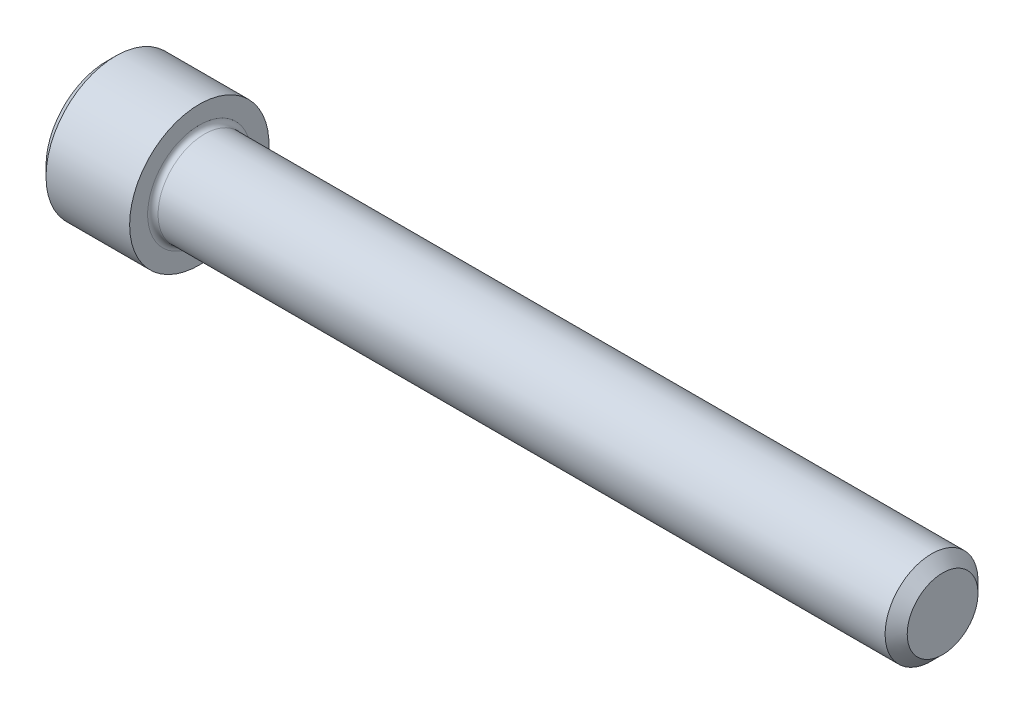
ISO-10303-21;
HEADER;
FILE_DESCRIPTION(('STEP AP214'),'2;1');
FILE_NAME('part.step','',(''),(''),'','','');
FILE_SCHEMA(('AUTOMOTIVE_DESIGN { 1 0 10303 214 1 1 1 1 }'));
ENDSEC;
DATA;
#1=APPLICATION_CONTEXT('core data for automotive mechanical design processes');
#2=APPLICATION_PROTOCOL_DEFINITION('international standard','automotive_design',2000,#1);
#3=PRODUCT_CONTEXT('',#1,'mechanical');
#4=PRODUCT('Part','Part','',(#3));
#5=PRODUCT_RELATED_PRODUCT_CATEGORY('part','',(#4));
#6=PRODUCT_DEFINITION_FORMATION('','',#4);
#7=PRODUCT_DEFINITION_CONTEXT('part definition',#1,'design');
#8=PRODUCT_DEFINITION('design','',#6,#7);
#9=PRODUCT_DEFINITION_SHAPE('','',#8);
#10=(LENGTH_UNIT() NAMED_UNIT(*) SI_UNIT(.MILLI.,.METRE.));
#11=(NAMED_UNIT(*) PLANE_ANGLE_UNIT() SI_UNIT($,.RADIAN.));
#12=(NAMED_UNIT(*) SI_UNIT($,.STERADIAN.) SOLID_ANGLE_UNIT());
#13=UNCERTAINTY_MEASURE_WITH_UNIT(LENGTH_MEASURE(1.E-05),#10,'distance_accuracy_value','');
#14=(GEOMETRIC_REPRESENTATION_CONTEXT(3) GLOBAL_UNCERTAINTY_ASSIGNED_CONTEXT((#13)) GLOBAL_UNIT_ASSIGNED_CONTEXT((#10,
#11,#12)) REPRESENTATION_CONTEXT('',''));
#15=CARTESIAN_POINT('',(0.,0.,0.));
#16=DIRECTION('',(0.,0.,1.));
#17=DIRECTION('',(1.,0.,0.));
#18=AXIS2_PLACEMENT_3D('',#15,#16,#17);
#19=CARTESIAN_POINT('',(0.,0.,0.));
#20=DIRECTION('',(-1.,0.,0.));
#21=DIRECTION('',(0.,0.,1.));
#22=AXIS2_PLACEMENT_3D('',#19,#20,#21);
#23=PLANE('',#22);
#24=DIRECTION('',(0.,-0.499999999999999,0.866025403784439));
#25=VECTOR('',#24,1.);
#26=CARTESIAN_POINT('',(0.,2.7496306570156,0.));
#27=LINE('',#26,#25);
#28=CARTESIAN_POINT('',(0.,2.7496306570156,0.));
#29=VERTEX_POINT('',#28);
#30=CARTESIAN_POINT('',(0.,1.3748153285078,2.38125));
#31=VERTEX_POINT('',#30);
#32=EDGE_CURVE('E259',#29,#31,#27,.T.);
#33=ORIENTED_EDGE('',*,*,#32,.T.);
#34=DIRECTION('',(0.,1.,0.));
#35=VECTOR('',#34,1.);
#36=CARTESIAN_POINT('',(0.,-1.37481532850779,2.38125));
#37=LINE('',#36,#35);
#38=CARTESIAN_POINT('',(0.,-1.37481532850779,2.38125));
#39=VERTEX_POINT('',#38);
#40=EDGE_CURVE('E130',#39,#31,#37,.T.);
#41=ORIENTED_EDGE('',*,*,#40,.F.);
#42=DIRECTION('',(0.,-0.500000000000001,-0.866025403784438));
#43=VECTOR('',#42,1.);
#44=CARTESIAN_POINT('',(0.,-1.37481532850779,2.38125));
#45=LINE('',#44,#43);
#46=CARTESIAN_POINT('',(0.,-2.74963065701559,0.));
#47=VERTEX_POINT('',#46);
#48=EDGE_CURVE('E262',#39,#47,#45,.T.);
#49=ORIENTED_EDGE('',*,*,#48,.T.);
#50=DIRECTION('',(0.,0.499999999999998,-0.86602540378444));
#51=VECTOR('',#50,1.);
#52=CARTESIAN_POINT('',(0.,-2.74963065701559,0.));
#53=LINE('',#52,#51);
#54=CARTESIAN_POINT('',(0.,-1.3748153285078,-2.38125));
#55=VERTEX_POINT('',#54);
#56=EDGE_CURVE('E265',#47,#55,#53,.T.);
#57=ORIENTED_EDGE('',*,*,#56,.T.);
#58=DIRECTION('',(0.,-1.,0.));
#59=VECTOR('',#58,1.);
#60=CARTESIAN_POINT('',(0.,1.3748153285078,-2.38125));
#61=LINE('',#60,#59);
#62=CARTESIAN_POINT('',(0.,1.3748153285078,-2.38125));
#63=VERTEX_POINT('',#62);
#64=EDGE_CURVE('E268',#63,#55,#61,.T.);
#65=ORIENTED_EDGE('',*,*,#64,.F.);
#66=DIRECTION('',(0.,-0.500000000000001,-0.866025403784438));
#67=VECTOR('',#66,1.);
#68=CARTESIAN_POINT('',(0.,2.7496306570156,0.));
#69=LINE('',#68,#67);
#70=EDGE_CURVE('E125',#29,#63,#69,.T.);
#71=ORIENTED_EDGE('',*,*,#70,.F.);
#72=EDGE_LOOP('',(#33,#41,#49,#57,#65,#71));
#73=FACE_BOUND('',#72,.T.);
#74=CARTESIAN_POINT('',(0.,0.,0.));
#75=DIRECTION('',(-1.,0.,0.));
#76=DIRECTION('',(0.,0.,1.));
#77=AXIS2_PLACEMENT_3D('',#74,#75,#76);
#78=CIRCLE('',#77,4.1275);
#79=CARTESIAN_POINT('',(0.,0.,4.1275));
#80=VERTEX_POINT('',#79);
#81=EDGE_CURVE('E154',#80,#80,#78,.T.);
#82=ORIENTED_EDGE('',*,*,#81,.T.);
#83=EDGE_LOOP('',(#82));
#84=FACE_BOUND('',#83,.T.);
#85=ADVANCED_FACE('F34',(#73,#84),#23,.T.);
#86=CARTESIAN_POINT('',(0.,0.,0.));
#87=DIRECTION('',(1.,0.,0.));
#88=DIRECTION('',(0.,0.,-1.));
#89=AXIS2_PLACEMENT_3D('',#86,#87,#88);
#90=CONICAL_SURFACE('',#89,4.1275,0.785398163397449);
#91=CARTESIAN_POINT('',(0.634999999999997,0.,0.));
#92=DIRECTION('',(-1.,0.,0.));
#93=DIRECTION('',(0.,0.,1.));
#94=AXIS2_PLACEMENT_3D('',#91,#92,#93);
#95=CIRCLE('',#94,4.7625);
#96=CARTESIAN_POINT('',(0.634999999999997,0.,4.7625));
#97=VERTEX_POINT('',#96);
#98=EDGE_CURVE('E151',#97,#97,#95,.T.);
#99=ORIENTED_EDGE('',*,*,#98,.T.);
#100=EDGE_LOOP('',(#99));
#101=FACE_BOUND('',#100,.T.);
#102=ORIENTED_EDGE('',*,*,#81,.F.);
#103=EDGE_LOOP('',(#102));
#104=FACE_BOUND('',#103,.T.);
#105=ADVANCED_FACE('F175',(#101,#104),#90,.T.);
#106=CARTESIAN_POINT('',(-31.75,0.,0.));
#107=DIRECTION('',(-1.,0.,0.));
#108=DIRECTION('',(0.,0.,1.));
#109=AXIS2_PLACEMENT_3D('',#106,#107,#108);
#110=CYLINDRICAL_SURFACE('',#109,4.7625);
#111=CARTESIAN_POINT('',(6.35,0.,0.));
#112=DIRECTION('',(-1.,0.,0.));
#113=DIRECTION('',(0.,0.,1.));
#114=AXIS2_PLACEMENT_3D('',#111,#112,#113);
#115=CIRCLE('',#114,4.7625);
#116=CARTESIAN_POINT('',(6.35,0.,4.7625));
#117=VERTEX_POINT('',#116);
#118=EDGE_CURVE('E148',#117,#117,#115,.T.);
#119=ORIENTED_EDGE('',*,*,#118,.T.);
#120=EDGE_LOOP('',(#119));
#121=FACE_BOUND('',#120,.T.);
#122=ORIENTED_EDGE('',*,*,#98,.F.);
#123=EDGE_LOOP('',(#122));
#124=FACE_BOUND('',#123,.T.);
#125=ADVANCED_FACE('F180',(#121,#124),#110,.T.);
#126=CARTESIAN_POINT('',(6.35,4.7625,0.));
#127=DIRECTION('',(1.,0.,0.));
#128=DIRECTION('',(0.,0.,-1.));
#129=AXIS2_PLACEMENT_3D('',#126,#127,#128);
#130=PLANE('',#129);
#131=CARTESIAN_POINT('',(6.35,0.,0.));
#132=DIRECTION('',(1.,0.,0.));
#133=DIRECTION('',(0.,0.,-1.));
#134=AXIS2_PLACEMENT_3D('',#131,#132,#133);
#135=CIRCLE('',#134,3.53059999999993);
#136=CARTESIAN_POINT('',(6.35,0.,-3.53059999999993));
#137=VERTEX_POINT('',#136);
#138=EDGE_CURVE('E42',#137,#137,#135,.F.);
#139=ORIENTED_EDGE('',*,*,#138,.T.);
#140=EDGE_LOOP('',(#139));
#141=FACE_BOUND('',#140,.T.);
#142=ORIENTED_EDGE('',*,*,#118,.F.);
#143=EDGE_LOOP('',(#142));
#144=FACE_BOUND('',#143,.T.);
#145=ADVANCED_FACE('F159',(#141,#144),#130,.T.);
#146=CARTESIAN_POINT('',(-31.75,0.,0.));
#147=DIRECTION('',(-1.,0.,0.));
#148=DIRECTION('',(0.,0.,1.));
#149=AXIS2_PLACEMENT_3D('',#146,#147,#148);
#150=CYLINDRICAL_SURFACE('',#149,3.17499999999993);
#151=CARTESIAN_POINT('',(6.7056,0.,0.));
#152=DIRECTION('',(1.,0.,0.));
#153=DIRECTION('',(0.,0.,-1.));
#154=AXIS2_PLACEMENT_3D('',#151,#152,#153);
#155=CIRCLE('',#154,3.17499999999993);
#156=CARTESIAN_POINT('',(6.7056,0.,-3.17499999999993));
#157=VERTEX_POINT('',#156);
#158=EDGE_CURVE('E11',#157,#157,#155,.T.);
#159=ORIENTED_EDGE('',*,*,#158,.T.);
#160=EDGE_LOOP('',(#159));
#161=FACE_BOUND('',#160,.T.);
#162=CARTESIAN_POINT('',(56.3943499999999,0.,0.));
#163=DIRECTION('',(-1.,0.,0.));
#164=DIRECTION('',(0.,0.,1.));
#165=AXIS2_PLACEMENT_3D('',#162,#163,#164);
#166=CIRCLE('',#165,3.17499999999986);
#167=CARTESIAN_POINT('',(56.3943499999999,0.,3.17499999999986));
#168=VERTEX_POINT('',#167);
#169=EDGE_CURVE('E145',#168,#168,#166,.T.);
#170=ORIENTED_EDGE('',*,*,#169,.T.);
#171=EDGE_LOOP('',(#170));
#172=FACE_BOUND('',#171,.T.);
#173=ADVANCED_FACE('F190',(#161,#172),#150,.T.);
#174=CARTESIAN_POINT('',(57.15,0.,0.));
#175=DIRECTION('',(-1.,0.,0.));
#176=DIRECTION('',(0.,0.,1.));
#177=AXIS2_PLACEMENT_3D('',#174,#175,#176);
#178=CONICAL_SURFACE('',#177,2.41935,0.785398163397287);
#179=ORIENTED_EDGE('',*,*,#169,.F.);
#180=EDGE_LOOP('',(#179));
#181=FACE_BOUND('',#180,.T.);
#182=CARTESIAN_POINT('',(57.15,0.,0.));
#183=DIRECTION('',(-1.,0.,0.));
#184=DIRECTION('',(0.,0.,1.));
#185=AXIS2_PLACEMENT_3D('',#182,#183,#184);
#186=CIRCLE('',#185,2.41935);
#187=CARTESIAN_POINT('',(57.15,0.,2.41935));
#188=VERTEX_POINT('',#187);
#189=EDGE_CURVE('E141',#188,#188,#186,.T.);
#190=ORIENTED_EDGE('',*,*,#189,.T.);
#191=EDGE_LOOP('',(#190));
#192=FACE_BOUND('',#191,.T.);
#193=ADVANCED_FACE('F170',(#181,#192),#178,.T.);
#194=CARTESIAN_POINT('',(57.15,2.41935,0.));
#195=DIRECTION('',(1.,0.,0.));
#196=DIRECTION('',(0.,0.,-1.));
#197=AXIS2_PLACEMENT_3D('',#194,#195,#196);
#198=PLANE('',#197);
#199=ORIENTED_EDGE('',*,*,#189,.F.);
#200=EDGE_LOOP('',(#199));
#201=FACE_BOUND('',#200,.T.);
#202=ADVANCED_FACE('F163',(#201),#198,.T.);
#203=CARTESIAN_POINT('',(6.7056,0.,0.));
#204=DIRECTION('',(1.,0.,0.));
#205=DIRECTION('',(0.,0.,-1.));
#206=AXIS2_PLACEMENT_3D('',#203,#204,#205);
#207=TOROIDAL_SURFACE('',#206,3.53059999999993,0.3556);
#208=ORIENTED_EDGE('',*,*,#158,.F.);
#209=EDGE_LOOP('',(#208));
#210=FACE_BOUND('',#209,.T.);
#211=ORIENTED_EDGE('',*,*,#138,.F.);
#212=EDGE_LOOP('',(#211));
#213=FACE_BOUND('',#212,.T.);
#214=ADVANCED_FACE('F36',(#210,#213),#207,.F.);
#215=CARTESIAN_POINT('',(3.048,2.7496306570156,0.));
#216=DIRECTION('',(0.,-0.866025403784439,-0.499999999999999));
#217=DIRECTION('',(0.,0.499999999999999,-0.866025403784439));
#218=AXIS2_PLACEMENT_3D('',#215,#216,#217);
#219=PLANE('',#218);
#220=ORIENTED_EDGE('',*,*,#32,.F.);
#221=DIRECTION('',(-1.,0.,0.));
#222=VECTOR('',#221,1.);
#223=CARTESIAN_POINT('',(3.048,2.7496306570156,0.));
#224=LINE('',#223,#222);
#225=CARTESIAN_POINT('',(3.048,2.7496306570156,0.));
#226=VERTEX_POINT('',#225);
#227=EDGE_CURVE('E249',#226,#29,#224,.T.);
#228=ORIENTED_EDGE('',*,*,#227,.F.);
#229=DIRECTION('',(0.,-0.499999999999999,0.866025403784439));
#230=VECTOR('',#229,1.);
#231=CARTESIAN_POINT('',(3.048,2.7496306570156,0.));
#232=LINE('',#231,#230);
#233=CARTESIAN_POINT('',(3.048,2.0622229927617,1.190625));
#234=VERTEX_POINT('',#233);
#235=EDGE_CURVE('E117',#226,#234,#232,.T.);
#236=ORIENTED_EDGE('',*,*,#235,.T.);
#237=CARTESIAN_POINT('',(3.048,1.3748153285078,2.38125));
#238=VERTEX_POINT('',#237);
#239=EDGE_CURVE('E108',#234,#238,#232,.T.);
#240=ORIENTED_EDGE('',*,*,#239,.T.);
#241=DIRECTION('',(-1.,0.,0.));
#242=VECTOR('',#241,1.);
#243=CARTESIAN_POINT('',(3.048,1.3748153285078,2.38125));
#244=LINE('',#243,#242);
#245=EDGE_CURVE('E122',#238,#31,#244,.T.);
#246=ORIENTED_EDGE('',*,*,#245,.T.);
#247=EDGE_LOOP('',(#220,#228,#236,#240,#246));
#248=FACE_BOUND('',#247,.T.);
#249=ADVANCED_FACE('F121',(#248),#219,.T.);
#250=CARTESIAN_POINT('',(3.048,-1.37481532850779,2.38125));
#251=DIRECTION('',(0.,0.,1.));
#252=DIRECTION('',(0.,-1.,0.));
#253=AXIS2_PLACEMENT_3D('',#250,#251,#252);
#254=PLANE('',#253);
#255=ORIENTED_EDGE('',*,*,#40,.T.);
#256=ORIENTED_EDGE('',*,*,#245,.F.);
#257=DIRECTION('',(0.,1.,0.));
#258=VECTOR('',#257,1.);
#259=CARTESIAN_POINT('',(3.048,-1.37481532850779,2.38125));
#260=LINE('',#259,#258);
#261=CARTESIAN_POINT('',(3.048,0.,2.38125));
#262=VERTEX_POINT('',#261);
#263=EDGE_CURVE('E105',#262,#238,#260,.T.);
#264=ORIENTED_EDGE('',*,*,#263,.F.);
#265=CARTESIAN_POINT('',(3.048,-1.37481532850779,2.38125));
#266=VERTEX_POINT('',#265);
#267=EDGE_CURVE('E116',#266,#262,#260,.T.);
#268=ORIENTED_EDGE('',*,*,#267,.F.);
#269=DIRECTION('',(-1.,0.,0.));
#270=VECTOR('',#269,1.);
#271=CARTESIAN_POINT('',(3.048,-1.37481532850779,2.38125));
#272=LINE('',#271,#270);
#273=EDGE_CURVE('E132',#266,#39,#272,.T.);
#274=ORIENTED_EDGE('',*,*,#273,.T.);
#275=EDGE_LOOP('',(#255,#256,#264,#268,#274));
#276=FACE_BOUND('',#275,.T.);
#277=ADVANCED_FACE('F127',(#276),#254,.F.);
#278=CARTESIAN_POINT('',(3.048,-1.37481532850779,2.38125));
#279=DIRECTION('',(0.,0.866025403784438,-0.500000000000001));
#280=DIRECTION('',(0.,0.500000000000001,0.866025403784438));
#281=AXIS2_PLACEMENT_3D('',#278,#279,#280);
#282=PLANE('',#281);
#283=ORIENTED_EDGE('',*,*,#48,.F.);
#284=ORIENTED_EDGE('',*,*,#273,.F.);
#285=DIRECTION('',(0.,-0.500000000000001,-0.866025403784438));
#286=VECTOR('',#285,1.);
#287=CARTESIAN_POINT('',(3.048,-1.37481532850779,2.38125));
#288=LINE('',#287,#286);
#289=CARTESIAN_POINT('',(3.048,-2.06222299276169,1.190625));
#290=VERTEX_POINT('',#289);
#291=EDGE_CURVE('E288',#266,#290,#288,.T.);
#292=ORIENTED_EDGE('',*,*,#291,.T.);
#293=CARTESIAN_POINT('',(3.048,-2.74963065701559,0.));
#294=VERTEX_POINT('',#293);
#295=EDGE_CURVE('E277',#290,#294,#288,.T.);
#296=ORIENTED_EDGE('',*,*,#295,.T.);
#297=DIRECTION('',(-1.,0.,0.));
#298=VECTOR('',#297,1.);
#299=CARTESIAN_POINT('',(3.048,-2.74963065701559,0.));
#300=LINE('',#299,#298);
#301=EDGE_CURVE('E137',#294,#47,#300,.T.);
#302=ORIENTED_EDGE('',*,*,#301,.T.);
#303=EDGE_LOOP('',(#283,#284,#292,#296,#302));
#304=FACE_BOUND('',#303,.T.);
#305=ADVANCED_FACE('F203',(#304),#282,.T.);
#306=CARTESIAN_POINT('',(3.048,-2.74963065701559,0.));
#307=DIRECTION('',(0.,0.86602540378444,0.499999999999998));
#308=DIRECTION('',(0.,-0.499999999999998,0.86602540378444));
#309=AXIS2_PLACEMENT_3D('',#306,#307,#308);
#310=PLANE('',#309);
#311=ORIENTED_EDGE('',*,*,#56,.F.);
#312=ORIENTED_EDGE('',*,*,#301,.F.);
#313=DIRECTION('',(0.,0.499999999999998,-0.86602540378444));
#314=VECTOR('',#313,1.);
#315=CARTESIAN_POINT('',(3.048,-2.74963065701559,0.));
#316=LINE('',#315,#314);
#317=CARTESIAN_POINT('',(3.048,-2.06222299276169,-1.19062499999999));
#318=VERTEX_POINT('',#317);
#319=EDGE_CURVE('E255',#294,#318,#316,.T.);
#320=ORIENTED_EDGE('',*,*,#319,.T.);
#321=CARTESIAN_POINT('',(3.048,-1.3748153285078,-2.38125));
#322=VERTEX_POINT('',#321);
#323=EDGE_CURVE('E287',#318,#322,#316,.T.);
#324=ORIENTED_EDGE('',*,*,#323,.T.);
#325=DIRECTION('',(-1.,0.,0.));
#326=VECTOR('',#325,1.);
#327=CARTESIAN_POINT('',(3.048,-1.3748153285078,-2.38125));
#328=LINE('',#327,#326);
#329=EDGE_CURVE('E248',#322,#55,#328,.T.);
#330=ORIENTED_EDGE('',*,*,#329,.T.);
#331=EDGE_LOOP('',(#311,#312,#320,#324,#330));
#332=FACE_BOUND('',#331,.T.);
#333=ADVANCED_FACE('F206',(#332),#310,.T.);
#334=CARTESIAN_POINT('',(3.048,1.3748153285078,-2.38125));
#335=DIRECTION('',(0.,0.,-1.));
#336=DIRECTION('',(0.,1.,0.));
#337=AXIS2_PLACEMENT_3D('',#334,#335,#336);
#338=PLANE('',#337);
#339=ORIENTED_EDGE('',*,*,#64,.T.);
#340=ORIENTED_EDGE('',*,*,#329,.F.);
#341=DIRECTION('',(0.,-1.,0.));
#342=VECTOR('',#341,1.);
#343=CARTESIAN_POINT('',(3.048,1.3748153285078,-2.38125));
#344=LINE('',#343,#342);
#345=CARTESIAN_POINT('',(3.048,0.,-2.38125));
#346=VERTEX_POINT('',#345);
#347=EDGE_CURVE('E252',#346,#322,#344,.T.);
#348=ORIENTED_EDGE('',*,*,#347,.F.);
#349=CARTESIAN_POINT('',(3.048,1.3748153285078,-2.38125));
#350=VERTEX_POINT('',#349);
#351=EDGE_CURVE('E49',#350,#346,#344,.T.);
#352=ORIENTED_EDGE('',*,*,#351,.F.);
#353=DIRECTION('',(-1.,0.,0.));
#354=VECTOR('',#353,1.);
#355=CARTESIAN_POINT('',(3.048,1.3748153285078,-2.38125));
#356=LINE('',#355,#354);
#357=EDGE_CURVE('E245',#350,#63,#356,.T.);
#358=ORIENTED_EDGE('',*,*,#357,.T.);
#359=EDGE_LOOP('',(#339,#340,#348,#352,#358));
#360=FACE_BOUND('',#359,.T.);
#361=ADVANCED_FACE('F210',(#360),#338,.F.);
#362=CARTESIAN_POINT('',(3.048,2.7496306570156,0.));
#363=DIRECTION('',(0.,0.866025403784438,-0.500000000000001));
#364=DIRECTION('',(0.,0.500000000000001,0.866025403784438));
#365=AXIS2_PLACEMENT_3D('',#362,#363,#364);
#366=PLANE('',#365);
#367=ORIENTED_EDGE('',*,*,#70,.T.);
#368=ORIENTED_EDGE('',*,*,#357,.F.);
#369=DIRECTION('',(0.,-0.500000000000001,-0.866025403784438));
#370=VECTOR('',#369,1.);
#371=CARTESIAN_POINT('',(3.048,2.7496306570156,0.));
#372=LINE('',#371,#370);
#373=CARTESIAN_POINT('',(3.048,2.0622229927617,-1.19062500000001));
#374=VERTEX_POINT('',#373);
#375=EDGE_CURVE('E235',#374,#350,#372,.T.);
#376=ORIENTED_EDGE('',*,*,#375,.F.);
#377=EDGE_CURVE('E241',#226,#374,#372,.T.);
#378=ORIENTED_EDGE('',*,*,#377,.F.);
#379=ORIENTED_EDGE('',*,*,#227,.T.);
#380=EDGE_LOOP('',(#367,#368,#376,#378,#379));
#381=FACE_BOUND('',#380,.T.);
#382=ADVANCED_FACE('F214',(#381),#366,.F.);
#383=CARTESIAN_POINT('',(3.048,4.12444598552339,-2.38125000000001));
#384=DIRECTION('',(1.,0.,0.));
#385=DIRECTION('',(0.,0.,-1.));
#386=AXIS2_PLACEMENT_3D('',#383,#384,#385);
#387=PLANE('',#386);
#388=ORIENTED_EDGE('',*,*,#347,.T.);
#389=ORIENTED_EDGE('',*,*,#323,.F.);
#390=CARTESIAN_POINT('',(3.048,0.,0.));
#391=DIRECTION('',(-1.,0.,0.));
#392=DIRECTION('',(0.,0.,1.));
#393=AXIS2_PLACEMENT_3D('',#390,#391,#392);
#394=CIRCLE('',#393,2.38125);
#395=EDGE_CURVE('E283',#346,#318,#394,.T.);
#396=ORIENTED_EDGE('',*,*,#395,.F.);
#397=EDGE_LOOP('',(#388,#389,#396));
#398=FACE_BOUND('',#397,.T.);
#399=ADVANCED_FACE('F218',(#398),#387,.F.);
#400=ORIENTED_EDGE('',*,*,#319,.F.);
#401=ORIENTED_EDGE('',*,*,#295,.F.);
#402=EDGE_CURVE('E135',#318,#290,#394,.T.);
#403=ORIENTED_EDGE('',*,*,#402,.F.);
#404=EDGE_LOOP('',(#400,#401,#403));
#405=FACE_BOUND('',#404,.T.);
#406=ADVANCED_FACE('F221',(#405),#387,.F.);
#407=ORIENTED_EDGE('',*,*,#291,.F.);
#408=ORIENTED_EDGE('',*,*,#267,.T.);
#409=EDGE_CURVE('E131',#290,#262,#394,.T.);
#410=ORIENTED_EDGE('',*,*,#409,.F.);
#411=EDGE_LOOP('',(#407,#408,#410));
#412=FACE_BOUND('',#411,.T.);
#413=ADVANCED_FACE('F226',(#412),#387,.F.);
#414=ORIENTED_EDGE('',*,*,#263,.T.);
#415=ORIENTED_EDGE('',*,*,#239,.F.);
#416=EDGE_CURVE('E111',#262,#234,#394,.T.);
#417=ORIENTED_EDGE('',*,*,#416,.F.);
#418=EDGE_LOOP('',(#414,#415,#417));
#419=FACE_BOUND('',#418,.T.);
#420=ADVANCED_FACE('F107',(#419),#387,.F.);
#421=ORIENTED_EDGE('',*,*,#235,.F.);
#422=ORIENTED_EDGE('',*,*,#377,.T.);
#423=EDGE_CURVE('E142',#234,#374,#394,.T.);
#424=ORIENTED_EDGE('',*,*,#423,.F.);
#425=EDGE_LOOP('',(#421,#422,#424));
#426=FACE_BOUND('',#425,.T.);
#427=ADVANCED_FACE('F229',(#426),#387,.F.);
#428=ORIENTED_EDGE('',*,*,#375,.T.);
#429=ORIENTED_EDGE('',*,*,#351,.T.);
#430=EDGE_CURVE('E238',#374,#346,#394,.T.);
#431=ORIENTED_EDGE('',*,*,#430,.F.);
#432=EDGE_LOOP('',(#428,#429,#431));
#433=FACE_BOUND('',#432,.T.);
#434=ADVANCED_FACE('F199',(#433),#387,.F.);
#435=CARTESIAN_POINT('',(3.048,0.,0.));
#436=DIRECTION('',(-1.,0.,0.));
#437=DIRECTION('',(0.,0.,1.));
#438=AXIS2_PLACEMENT_3D('',#435,#436,#437);
#439=CONICAL_SURFACE('',#438,2.38125,1.04719755119659);
#440=CARTESIAN_POINT('',(4.42281532850781,0.,0.));
#441=VERTEX_POINT('',#440);
#442=VERTEX_LOOP('',#441);
#443=FACE_BOUND('',#442,.T.);
#444=ORIENTED_EDGE('',*,*,#416,.T.);
#445=ORIENTED_EDGE('',*,*,#423,.T.);
#446=ORIENTED_EDGE('',*,*,#430,.T.);
#447=ORIENTED_EDGE('',*,*,#395,.T.);
#448=ORIENTED_EDGE('',*,*,#402,.T.);
#449=ORIENTED_EDGE('',*,*,#409,.T.);
#450=EDGE_LOOP('',(#444,#445,#446,#447,#448,#449));
#451=FACE_BOUND('',#450,.T.);
#452=ADVANCED_FACE('F197',(#443,#451),#439,.F.);
#453=CLOSED_SHELL('',(#85,#105,#125,#145,#173,#193,#202,#214,#249,#277,#305,#333,#361,#382,#399,
#406,#413,#420,#427,#434,#452));
#454=MANIFOLD_SOLID_BREP('B2',#453);
#455=ADVANCED_BREP_SHAPE_REPRESENTATION('',(#18,#454),#14);
#456=SHAPE_DEFINITION_REPRESENTATION(#9,#455);
ENDSEC;
END-ISO-10303-21;
